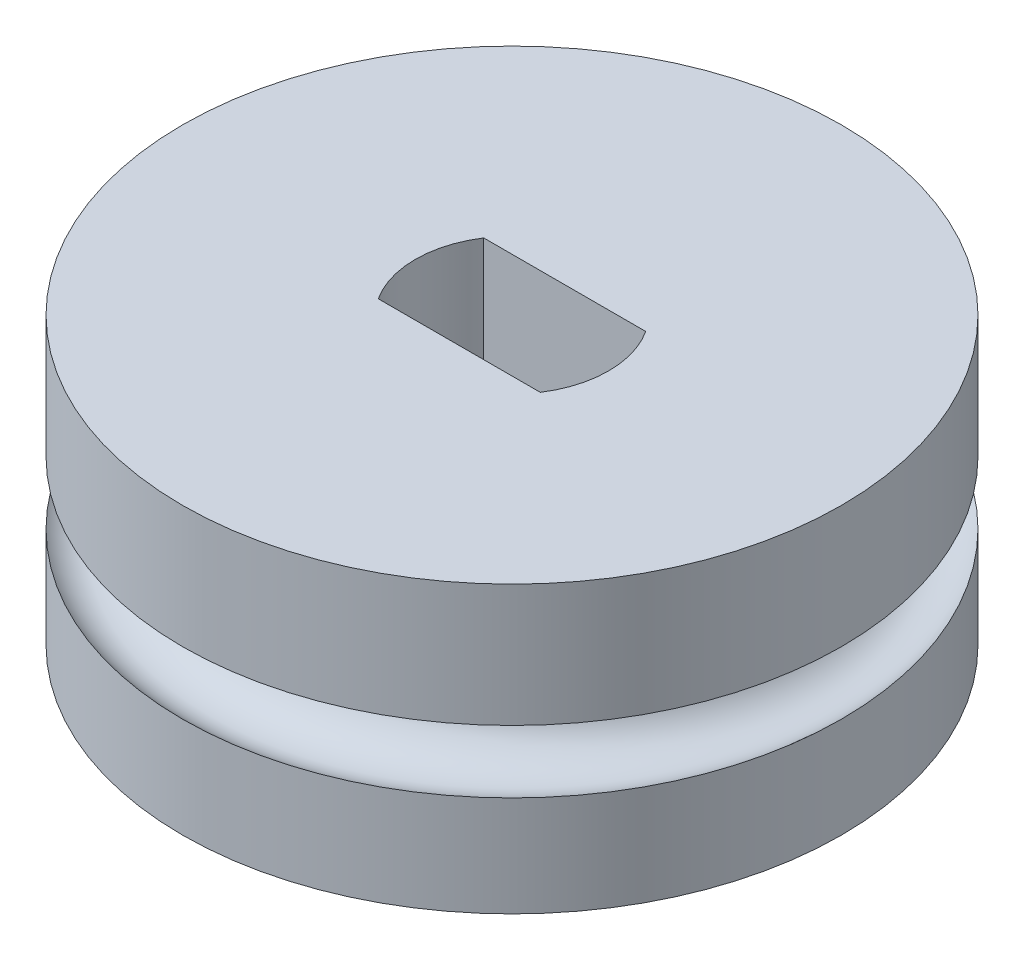
ISO-10303-21;
HEADER;
FILE_DESCRIPTION(('STEP AP214'),'2;1');
FILE_NAME('part.step','',(''),(''),'','','');
FILE_SCHEMA(('AUTOMOTIVE_DESIGN { 1 0 10303 214 1 1 1 1 }'));
ENDSEC;
DATA;
#1=APPLICATION_CONTEXT('core data for automotive mechanical design processes');
#2=APPLICATION_PROTOCOL_DEFINITION('international standard','automotive_design',2000,#1);
#3=PRODUCT_CONTEXT('',#1,'mechanical');
#4=PRODUCT('Part','Part','',(#3));
#5=PRODUCT_RELATED_PRODUCT_CATEGORY('part','',(#4));
#6=PRODUCT_DEFINITION_FORMATION('','',#4);
#7=PRODUCT_DEFINITION_CONTEXT('part definition',#1,'design');
#8=PRODUCT_DEFINITION('design','',#6,#7);
#9=PRODUCT_DEFINITION_SHAPE('','',#8);
#10=(LENGTH_UNIT() NAMED_UNIT(*) SI_UNIT(.MILLI.,.METRE.));
#11=(NAMED_UNIT(*) PLANE_ANGLE_UNIT() SI_UNIT($,.RADIAN.));
#12=(NAMED_UNIT(*) SI_UNIT($,.STERADIAN.) SOLID_ANGLE_UNIT());
#13=UNCERTAINTY_MEASURE_WITH_UNIT(LENGTH_MEASURE(1.E-05),#10,'distance_accuracy_value','');
#14=(GEOMETRIC_REPRESENTATION_CONTEXT(3) GLOBAL_UNCERTAINTY_ASSIGNED_CONTEXT((#13)) GLOBAL_UNIT_ASSIGNED_CONTEXT((#10,
#11,#12)) REPRESENTATION_CONTEXT('',''));
#15=CARTESIAN_POINT('',(0.,0.,0.));
#16=DIRECTION('',(0.,0.,1.));
#17=DIRECTION('',(1.,0.,0.));
#18=AXIS2_PLACEMENT_3D('',#15,#16,#17);
#19=CARTESIAN_POINT('',(0.,-5.01198563445667,1.2));
#20=DIRECTION('',(0.,0.,1.));
#21=DIRECTION('',(1.,0.,0.));
#22=AXIS2_PLACEMENT_3D('',#19,#20,#21);
#23=PLANE('',#22);
#24=DIRECTION('',(1.,0.,0.));
#25=VECTOR('',#24,1.);
#26=CARTESIAN_POINT('',(0.,8.,1.2));
#27=LINE('',#26,#25);
#28=CARTESIAN_POINT('',(-1.84390889145858,8.,1.2));
#29=VERTEX_POINT('',#28);
#30=CARTESIAN_POINT('',(1.84390889145858,8.,1.2));
#31=VERTEX_POINT('',#30);
#32=EDGE_CURVE('E187',#29,#31,#27,.T.);
#33=ORIENTED_EDGE('',*,*,#32,.T.);
#34=DIRECTION('',(0.,1.,0.));
#35=VECTOR('',#34,1.);
#36=CARTESIAN_POINT('',(1.84390889145858,-5.01198563445667,1.2));
#37=LINE('',#36,#35);
#38=CARTESIAN_POINT('',(1.84390889145858,1.,1.2));
#39=VERTEX_POINT('',#38);
#40=EDGE_CURVE('E221',#39,#31,#37,.T.);
#41=ORIENTED_EDGE('',*,*,#40,.F.);
#42=DIRECTION('',(-1.,0.,0.));
#43=VECTOR('',#42,1.);
#44=CARTESIAN_POINT('',(0.,1.,1.2));
#45=LINE('',#44,#43);
#46=CARTESIAN_POINT('',(-1.84390889145858,1.,1.2));
#47=VERTEX_POINT('',#46);
#48=EDGE_CURVE('E203',#39,#47,#45,.T.);
#49=ORIENTED_EDGE('',*,*,#48,.T.);
#50=DIRECTION('',(0.,1.,0.));
#51=VECTOR('',#50,1.);
#52=CARTESIAN_POINT('',(-1.84390889145858,-5.01198563445667,1.2));
#53=LINE('',#52,#51);
#54=EDGE_CURVE('E201',#47,#29,#53,.T.);
#55=ORIENTED_EDGE('',*,*,#54,.T.);
#56=EDGE_LOOP('',(#33,#41,#49,#55));
#57=FACE_BOUND('',#56,.T.);
#58=ADVANCED_FACE('F59',(#57),#23,.F.);
#59=CARTESIAN_POINT('',(0.,-5.01198563445667,-1.2));
#60=DIRECTION('',(0.,0.,1.));
#61=DIRECTION('',(1.,0.,0.));
#62=AXIS2_PLACEMENT_3D('',#59,#60,#61);
#63=PLANE('',#62);
#64=DIRECTION('',(0.,1.,0.));
#65=VECTOR('',#64,1.);
#66=CARTESIAN_POINT('',(1.84390889145858,-5.01198563445667,-1.2));
#67=LINE('',#66,#65);
#68=CARTESIAN_POINT('',(1.84390889145858,0.999999999999998,-1.2));
#69=VERTEX_POINT('',#68);
#70=CARTESIAN_POINT('',(1.84390889145858,8.,-1.2));
#71=VERTEX_POINT('',#70);
#72=EDGE_CURVE('E217',#69,#71,#67,.T.);
#73=ORIENTED_EDGE('',*,*,#72,.T.);
#74=DIRECTION('',(1.,0.,0.));
#75=VECTOR('',#74,1.);
#76=CARTESIAN_POINT('',(0.,8.,-1.2));
#77=LINE('',#76,#75);
#78=CARTESIAN_POINT('',(-1.84390889145858,8.,-1.2));
#79=VERTEX_POINT('',#78);
#80=EDGE_CURVE('E208',#79,#71,#77,.T.);
#81=ORIENTED_EDGE('',*,*,#80,.F.);
#82=DIRECTION('',(0.,1.,0.));
#83=VECTOR('',#82,1.);
#84=CARTESIAN_POINT('',(-1.84390889145858,-5.01198563445667,-1.2));
#85=LINE('',#84,#83);
#86=CARTESIAN_POINT('',(-1.84390889145858,1.,-1.2));
#87=VERTEX_POINT('',#86);
#88=EDGE_CURVE('E214',#87,#79,#85,.T.);
#89=ORIENTED_EDGE('',*,*,#88,.F.);
#90=DIRECTION('',(-1.,0.,0.));
#91=VECTOR('',#90,1.);
#92=CARTESIAN_POINT('',(0.,1.,-1.2));
#93=LINE('',#92,#91);
#94=EDGE_CURVE('E196',#69,#87,#93,.T.);
#95=ORIENTED_EDGE('',*,*,#94,.F.);
#96=EDGE_LOOP('',(#73,#81,#89,#95));
#97=FACE_BOUND('',#96,.T.);
#98=ADVANCED_FACE('F158',(#97),#63,.T.);
#99=CARTESIAN_POINT('',(0.,-21.2132034355964,0.));
#100=DIRECTION('',(0.,1.,0.));
#101=DIRECTION('',(0.,0.,1.));
#102=AXIS2_PLACEMENT_3D('',#99,#100,#101);
#103=CYLINDRICAL_SURFACE('',#102,7.5);
#104=CARTESIAN_POINT('',(0.,3.78585715714572,0.));
#105=DIRECTION('',(0.,1.,0.));
#106=DIRECTION('',(0.,0.,1.));
#107=AXIS2_PLACEMENT_3D('',#104,#105,#106);
#108=CIRCLE('',#107,7.5);
#109=CARTESIAN_POINT('',(0.,3.78585715714572,-7.5));
#110=VERTEX_POINT('',#109);
#111=EDGE_CURVE('E68',#110,#110,#108,.T.);
#112=ORIENTED_EDGE('',*,*,#111,.F.);
#113=EDGE_LOOP('',(#112));
#114=FACE_BOUND('',#113,.T.);
#115=CARTESIAN_POINT('',(0.,1.5,0.));
#116=DIRECTION('',(0.,-1.,0.));
#117=DIRECTION('',(0.,0.,-1.));
#118=AXIS2_PLACEMENT_3D('',#115,#116,#117);
#119=CIRCLE('',#118,7.5);
#120=CARTESIAN_POINT('',(0.,1.5,-7.5));
#121=VERTEX_POINT('',#120);
#122=EDGE_CURVE('E193',#121,#121,#119,.T.);
#123=ORIENTED_EDGE('',*,*,#122,.F.);
#124=EDGE_LOOP('',(#123));
#125=FACE_BOUND('',#124,.T.);
#126=ADVANCED_FACE('F163',(#114,#125),#103,.T.);
#127=CARTESIAN_POINT('',(0.,8.,0.));
#128=DIRECTION('',(0.,1.,0.));
#129=DIRECTION('',(0.,0.,1.));
#130=AXIS2_PLACEMENT_3D('',#127,#128,#129);
#131=PLANE('',#130);
#132=CARTESIAN_POINT('',(0.,8.,0.));
#133=DIRECTION('',(0.,1.,0.));
#134=DIRECTION('',(0.,0.,1.));
#135=AXIS2_PLACEMENT_3D('',#132,#133,#134);
#136=CIRCLE('',#135,2.2);
#137=EDGE_CURVE('E181',#31,#71,#136,.T.);
#138=ORIENTED_EDGE('',*,*,#137,.F.);
#139=ORIENTED_EDGE('',*,*,#32,.F.);
#140=EDGE_CURVE('E209',#79,#29,#136,.T.);
#141=ORIENTED_EDGE('',*,*,#140,.F.);
#142=ORIENTED_EDGE('',*,*,#80,.T.);
#143=EDGE_LOOP('',(#138,#139,#141,#142));
#144=FACE_BOUND('',#143,.T.);
#145=CARTESIAN_POINT('',(0.,8.,0.));
#146=DIRECTION('',(0.,1.,0.));
#147=DIRECTION('',(0.,0.,1.));
#148=AXIS2_PLACEMENT_3D('',#145,#146,#147);
#149=CIRCLE('',#148,7.5);
#150=CARTESIAN_POINT('',(0.,8.,7.5));
#151=VERTEX_POINT('',#150);
#152=EDGE_CURVE('E184',#151,#151,#149,.T.);
#153=ORIENTED_EDGE('',*,*,#152,.T.);
#154=EDGE_LOOP('',(#153));
#155=FACE_BOUND('',#154,.T.);
#156=ADVANCED_FACE('F167',(#144,#155),#131,.T.);
#157=CARTESIAN_POINT('',(0.,-5.01198563445667,0.));
#158=DIRECTION('',(0.,1.,0.));
#159=DIRECTION('',(0.,0.,1.));
#160=AXIS2_PLACEMENT_3D('',#157,#158,#159);
#161=CYLINDRICAL_SURFACE('',#160,2.2);
#162=CARTESIAN_POINT('',(0.,1.,0.));
#163=DIRECTION('',(0.,1.,0.));
#164=DIRECTION('',(0.,0.,1.));
#165=AXIS2_PLACEMENT_3D('',#162,#163,#164);
#166=CIRCLE('',#165,2.2);
#167=EDGE_CURVE('E200',#47,#87,#166,.F.);
#168=ORIENTED_EDGE('',*,*,#167,.T.);
#169=ORIENTED_EDGE('',*,*,#88,.T.);
#170=ORIENTED_EDGE('',*,*,#140,.T.);
#171=ORIENTED_EDGE('',*,*,#54,.F.);
#172=EDGE_LOOP('',(#168,#169,#170,#171));
#173=FACE_BOUND('',#172,.T.);
#174=ADVANCED_FACE('F169',(#173),#161,.F.);
#175=CARTESIAN_POINT('',(0.,1.,0.));
#176=DIRECTION('',(0.,1.,0.));
#177=DIRECTION('',(0.,0.,1.));
#178=AXIS2_PLACEMENT_3D('',#175,#176,#177);
#179=CIRCLE('',#178,2.2);
#180=EDGE_CURVE('E204',#69,#39,#179,.F.);
#181=ORIENTED_EDGE('',*,*,#180,.T.);
#182=ORIENTED_EDGE('',*,*,#40,.T.);
#183=ORIENTED_EDGE('',*,*,#137,.T.);
#184=ORIENTED_EDGE('',*,*,#72,.F.);
#185=EDGE_LOOP('',(#181,#182,#183,#184));
#186=FACE_BOUND('',#185,.T.);
#187=ADVANCED_FACE('F174',(#186),#161,.F.);
#188=CARTESIAN_POINT('',(0.,1.,0.));
#189=DIRECTION('',(0.,1.,0.));
#190=DIRECTION('',(0.,0.,1.));
#191=AXIS2_PLACEMENT_3D('',#188,#189,#190);
#192=PLANE('',#191);
#193=ORIENTED_EDGE('',*,*,#48,.F.);
#194=ORIENTED_EDGE('',*,*,#180,.F.);
#195=ORIENTED_EDGE('',*,*,#94,.T.);
#196=ORIENTED_EDGE('',*,*,#167,.F.);
#197=EDGE_LOOP('',(#193,#194,#195,#196));
#198=FACE_BOUND('',#197,.T.);
#199=ADVANCED_FACE('F251',(#198),#192,.T.);
#200=CARTESIAN_POINT('',(0.,5.21414284285428,0.));
#201=DIRECTION('',(0.,-1.,0.));
#202=DIRECTION('',(0.,0.,-1.));
#203=AXIS2_PLACEMENT_3D('',#200,#201,#202);
#204=CIRCLE('',#203,7.5);
#205=CARTESIAN_POINT('',(0.,5.21414284285428,-7.5));
#206=VERTEX_POINT('',#205);
#207=EDGE_CURVE('E227',#206,#206,#204,.T.);
#208=ORIENTED_EDGE('',*,*,#207,.F.);
#209=EDGE_LOOP('',(#208));
#210=FACE_BOUND('',#209,.T.);
#211=ORIENTED_EDGE('',*,*,#152,.F.);
#212=EDGE_LOOP('',(#211));
#213=FACE_BOUND('',#212,.T.);
#214=ADVANCED_FACE('F154',(#210,#213),#103,.T.);
#215=CARTESIAN_POINT('',(0.,4.5,0.));
#216=DIRECTION('',(0.,-1.,0.));
#217=DIRECTION('',(0.,0.,-1.));
#218=AXIS2_PLACEMENT_3D('',#215,#216,#217);
#219=TOROIDAL_SURFACE('',#218,6.8,1.);
#220=CARTESIAN_POINT('',(0.,5.2,0.));
#221=DIRECTION('',(0.,1.,0.));
#222=DIRECTION('',(0.,0.,1.));
#223=AXIS2_PLACEMENT_3D('',#220,#221,#222);
#224=CIRCLE('',#223,6.08585715714571);
#225=CARTESIAN_POINT('',(-6.0427769594019,5.2,0.722844351228663));
#226=VERTEX_POINT('',#225);
#227=CARTESIAN_POINT('',(-6.0427769594019,5.2,-0.722844351228663));
#228=VERTEX_POINT('',#227);
#229=EDGE_CURVE('E13',#226,#228,#224,.F.);
#230=ORIENTED_EDGE('',*,*,#229,.F.);
#231=CARTESIAN_POINT('',(-6.23014016278492,5.34094636474923,0.599125535929147));
#232=CARTESIAN_POINT('',(-6.21483652507629,5.33198051386924,0.612673729165902));
#233=CARTESIAN_POINT('',(-6.19924553837021,5.3223209192291,0.62541616448251));
#234=CARTESIAN_POINT('',(-6.16778809326167,5.30158388782306,0.649278293484025));
#235=CARTESIAN_POINT('',(-6.15192182518226,5.2905073993514,0.660399061956239));
#236=CARTESIAN_POINT('',(-6.10463838029807,5.25531965407915,0.691135036840744));
#237=CARTESIAN_POINT('',(-6.07322501250057,5.22907538464081,0.708389499165604));
#238=CARTESIAN_POINT('',(-6.01112280230856,5.16977302294412,0.737871939486779));
#239=CARTESIAN_POINT('',(-5.98056359307657,5.13642457258631,0.749780004232419));
#240=CARTESIAN_POINT('',(-5.92393027648112,5.06482216343346,0.76860267079672));
#241=CARTESIAN_POINT('',(-5.89786371498051,5.02656013626157,0.775508932673708));
#242=CARTESIAN_POINT('',(-5.85158197611424,4.946615182626,0.785864727822273));
#243=CARTESIAN_POINT('',(-5.83132784467134,4.90495755304961,0.789337673886762));
#244=CARTESIAN_POINT('',(-5.79698709331275,4.81906931950578,0.794288635899798));
#245=CARTESIAN_POINT('',(-5.78290255169631,4.77483785418667,0.795765979954896));
#246=CARTESIAN_POINT('',(-5.75991141808077,4.67958923313174,0.797848275442555));
#247=CARTESIAN_POINT('',(-5.75179143025008,4.62837865769691,0.798332662434512));
#248=CARTESIAN_POINT('',(-5.74370168279974,4.52531446481744,0.79881512812049));
#249=CARTESIAN_POINT('',(-5.74373395218491,4.47346069049901,0.798813085747737));
#250=CARTESIAN_POINT('',(-5.75221005029015,4.36717216993201,0.798307779240028));
#251=CARTESIAN_POINT('',(-5.7611788734428,4.3127783877184,0.797773232591837));
#252=CARTESIAN_POINT('',(-5.78816467023473,4.20627234389858,0.795241677751739));
#253=CARTESIAN_POINT('',(-5.806186211281,4.15416124842983,0.793243931091897));
#254=CARTESIAN_POINT('',(-5.85043598283564,4.05471818150436,0.786042365308653));
#255=CARTESIAN_POINT('',(-5.8765321879339,4.00732447590586,0.780888903703346));
#256=CARTESIAN_POINT('',(-5.93583181946151,3.9182635687632,0.765059335023062));
#257=CARTESIAN_POINT('',(-5.96902196440694,3.87658590163435,0.754393496181631));
#258=CARTESIAN_POINT('',(-6.03560258560141,3.805438923179,0.726975503856008));
#259=CARTESIAN_POINT('',(-6.06843761005257,3.77509238686389,0.711162917221054));
#260=CARTESIAN_POINT('',(-6.13516706751248,3.72081213991897,0.672390313188757));
#261=CARTESIAN_POINT('',(-6.16906035436668,3.69687174292564,0.649437802593685));
#262=CARTESIAN_POINT('',(-6.22993074981263,3.65856743620578,0.600385131968745));
#263=CARTESIAN_POINT('',(-6.25717138205375,3.64329794046201,0.57530750879007));
#264=CARTESIAN_POINT('',(-6.30874279311262,3.61687154592132,0.52043157323337));
#265=CARTESIAN_POINT('',(-6.33307311138616,3.60571529744732,0.490632515439182));
#266=CARTESIAN_POINT('',(-6.37719583941032,3.58701355218827,0.427624320944309));
#267=CARTESIAN_POINT('',(-6.39705586377502,3.57941206797389,0.394478815800213));
#268=CARTESIAN_POINT('',(-6.43192011473528,3.56688243233632,0.325262563599958));
#269=CARTESIAN_POINT('',(-6.44692353941214,3.56195472231429,0.289191334678563));
#270=CARTESIAN_POINT('',(-6.47225414041002,3.55398936237212,0.212908451843782));
#271=CARTESIAN_POINT('',(-6.48226310215498,3.55107657769679,0.172577983727061));
#272=CARTESIAN_POINT('',(-6.49591723631791,3.54717280138874,0.0907598599206215));
#273=CARTESIAN_POINT('',(-6.49956077307003,3.54618230370153,0.0492719095847534));
#274=CARTESIAN_POINT('',(-6.50037931749134,3.54595580246534,-0.0353400534743612));
#275=CARTESIAN_POINT('',(-6.49730580022696,3.54678721085151,-0.0784668935317196));
#276=CARTESIAN_POINT('',(-6.48427896172801,3.550491489008,-0.163586077479629));
#277=CARTESIAN_POINT('',(-6.47432478418528,3.55336461287402,-0.205578279486863));
#278=CARTESIAN_POINT('',(-6.44786933413316,3.56163449064975,-0.287296015857422));
#279=CARTESIAN_POINT('',(-6.4313538712781,3.56703671889926,-0.327016422509396));
#280=CARTESIAN_POINT('',(-6.39247511036111,3.58111434719564,-0.402854136338897));
#281=CARTESIAN_POINT('',(-6.37011371574154,3.58978868224704,-0.438972611031385));
#282=CARTESIAN_POINT('',(-6.32156472601228,3.61092188285993,-0.505256714057651));
#283=CARTESIAN_POINT('',(-6.2955405186304,3.62323597253476,-0.535587759329248));
#284=CARTESIAN_POINT('',(-6.24063016666398,3.65246795953726,-0.59096280605575));
#285=CARTESIAN_POINT('',(-6.2117459472857,3.66938277312436,-0.616010329017085));
#286=CARTESIAN_POINT('',(-6.15470720131655,3.70709394551578,-0.659125950426953));
#287=CARTESIAN_POINT('',(-6.12660744821079,3.72760843126449,-0.677514485453381));
#288=CARTESIAN_POINT('',(-6.0711999348764,3.77303028269099,-0.709389757783455));
#289=CARTESIAN_POINT('',(-6.04389227518154,3.79793820317443,-0.72287587534766));
#290=CARTESIAN_POINT('',(-5.99127615082543,3.85198852084413,-0.745647598601843));
#291=CARTESIAN_POINT('',(-5.96598944035071,3.88116934081212,-0.754891556561311));
#292=CARTESIAN_POINT('',(-5.91879072594484,3.94294557135221,-0.769899641214449));
#293=CARTESIAN_POINT('',(-5.89688043917357,3.97554270530602,-0.775662001582035));
#294=CARTESIAN_POINT('',(-5.85458962170278,4.04778166551724,-0.785259544484753));
#295=CARTESIAN_POINT('',(-5.83476199736924,4.08779148145936,-0.788754534339019));
#296=CARTESIAN_POINT('',(-5.80081498694204,4.17027809852173,-0.793807781879055));
#297=CARTESIAN_POINT('',(-5.78669908145835,4.21275638590584,-0.795364859835102));
#298=CARTESIAN_POINT('',(-5.76274111209715,4.30586521488066,-0.797642187175254));
#299=CARTESIAN_POINT('',(-5.75387561629473,4.3567530300369,-0.798199139947462));
#300=CARTESIAN_POINT('',(-5.74422746966985,4.4592953055536,-0.798790461485622));
#301=CARTESIAN_POINT('',(-5.74344756617084,4.51095002052168,-0.798824652629443));
#302=CARTESIAN_POINT('',(-5.75019957967234,4.61710214423702,-0.798432541751631));
#303=CARTESIAN_POINT('',(-5.75827548949762,4.67156588913195,-0.797976139486806));
#304=CARTESIAN_POINT('',(-5.78348780337916,4.77840062038693,-0.79573122548343));
#305=CARTESIAN_POINT('',(-5.80063306996227,4.83076950572556,-0.793941410040766));
#306=CARTESIAN_POINT('',(-5.84329748582105,4.93114219043632,-0.787354867579327));
#307=CARTESIAN_POINT('',(-5.86872610674062,4.97918631546521,-0.782590158734574));
#308=CARTESIAN_POINT('',(-5.92686941749764,5.06958913454869,-0.767733776751751));
#309=CARTESIAN_POINT('',(-5.95955002598668,5.11197298404956,-0.75766672801229));
#310=CARTESIAN_POINT('',(-6.00248611107812,5.15927203502362,-0.740657312804439));
#311=CARTESIAN_POINT('',(-6.01044202224948,5.16771836252529,-0.737362039329423));
#312=CARTESIAN_POINT('',(-6.02656425765327,5.18424097648048,-0.730365115452859));
#313=CARTESIAN_POINT('',(-6.03473066512803,5.19231711291972,-0.726663302335127));
#314=CARTESIAN_POINT('',(-6.06989773785675,5.22589623973313,-0.709972436903678));
#315=CARTESIAN_POINT('',(-6.09775760511264,5.24953901779358,-0.694899742331459));
#316=CARTESIAN_POINT('',(-6.15377730351311,5.29234677943597,-0.659680743848888));
#317=CARTESIAN_POINT('',(-6.18193742611358,5.31150689959963,-0.639528978217929));
#318=CARTESIAN_POINT('',(-6.22378686901113,5.33735463052345,-0.604978663861079));
#319=CARTESIAN_POINT('',(-6.23800737070019,5.34564889098483,-0.592381882532189));
#320=CARTESIAN_POINT('',(-6.26580062475781,5.36106226953037,-0.56589610922042));
#321=CARTESIAN_POINT('',(-6.2793747427777,5.36818395113768,-0.55201004279812));
#322=CARTESIAN_POINT('',(-6.29253709324753,5.37476418762898,-0.537493993571804));
#323=B_SPLINE_CURVE_WITH_KNOTS('',3,(#231,#232,#233,#234,#235,#236,#237,#238,#239,#240,#241,
#242,#243,#244,#245,#246,#247,#248,#249,#250,#251,#252,#253,#254,#255,#256,#257,#258,#259,#260,
#261,#262,#263,#264,#265,#266,#267,#268,#269,#270,#271,#272,#273,#274,#275,#276,#277,#278,#279,
#280,#281,#282,#283,#284,#285,#286,#287,#288,#289,#290,#291,#292,#293,#294,#295,#296,#297,#298,
#299,#300,#301,#302,#303,#304,#305,#306,#307,#308,#309,#310,#311,#312,#313,#314,#315,#316,#317,
#318,#319,#320,#321,#322),.UNSPECIFIED.,.F.,.F.,(4,2,2,2,2,2,2,2,2,2,2,2,2,2,2,2,2,2,2,2,2,2,2,
2,2,2,2,2,2,2,2,2,2,2,2,2,2,2,2,2,2,2,2,2,2,4),(0.,0.0669049812390851,0.13376541653671,
0.266173735745224,0.405696895027061,0.545452161166908,0.684247681870661,0.823089921597613,
0.977979301650181,1.13290723195985,1.29750706517469,1.46219002819357,1.62431116178251,
1.78613138534683,1.92750031492702,2.06872111097809,2.1882844716344,2.30786672769851,
2.42549624682269,2.54314517896308,2.66755387435646,2.79199453323114,2.92111706128408,
3.05025566171701,3.17967508903796,3.30905242960811,3.43385177783622,3.55856768170676,
3.67605343546218,3.79355403602663,3.91218474845019,4.03087559561152,4.16472757951963,
4.29866100781552,4.45296498556462,4.60732139101864,4.77171884095532,4.9362772367824,
5.09909435054677,5.26116191318068,5.29733920877342,5.33353103735086,5.4515073440014,
5.56961106046006,5.63172323013886,5.69369775172494),.UNSPECIFIED.);
#324=EDGE_CURVE('E115',#226,#228,#323,.T.);
#325=ORIENTED_EDGE('',*,*,#324,.T.);
#326=EDGE_LOOP('',(#230,#325));
#327=FACE_BOUND('',#326,.T.);
#328=ORIENTED_EDGE('',*,*,#111,.T.);
#329=CARTESIAN_POINT('',(0.,4.5,-6.8));
#330=DIRECTION('',(1.,0.,0.));
#331=DIRECTION('',(0.,1.,0.));
#332=AXIS2_PLACEMENT_3D('',#329,#330,#331);
#333=CIRCLE('',#332,1.);
#334=EDGE_CURVE('E81',#206,#110,#333,.T.);
#335=ORIENTED_EDGE('',*,*,#334,.F.);
#336=ORIENTED_EDGE('',*,*,#207,.T.);
#337=ORIENTED_EDGE('',*,*,#334,.T.);
#338=EDGE_LOOP('',(#328,#335,#336,#337));
#339=FACE_BOUND('',#338,.T.);
#340=ADVANCED_FACE('F119',(#327,#339),#219,.F.);
#341=CARTESIAN_POINT('',(0.,1.5,0.));
#342=DIRECTION('',(0.,-1.,0.));
#343=DIRECTION('',(0.,0.,-1.));
#344=AXIS2_PLACEMENT_3D('',#341,#342,#343);
#345=CYLINDRICAL_SURFACE('',#344,3.25);
#346=CARTESIAN_POINT('',(0.,1.5,0.));
#347=DIRECTION('',(0.,-1.,0.));
#348=DIRECTION('',(0.,0.,-1.));
#349=AXIS2_PLACEMENT_3D('',#346,#347,#348);
#350=CIRCLE('',#349,3.25);
#351=CARTESIAN_POINT('',(0.,1.5,-3.25));
#352=VERTEX_POINT('',#351);
#353=EDGE_CURVE('E127',#352,#352,#350,.T.);
#354=ORIENTED_EDGE('',*,*,#353,.T.);
#355=EDGE_LOOP('',(#354));
#356=FACE_BOUND('',#355,.T.);
#357=CARTESIAN_POINT('',(0.,0.,0.));
#358=DIRECTION('',(0.,-1.,0.));
#359=DIRECTION('',(0.,0.,-1.));
#360=AXIS2_PLACEMENT_3D('',#357,#358,#359);
#361=CIRCLE('',#360,3.25);
#362=CARTESIAN_POINT('',(0.,0.,-3.25));
#363=VERTEX_POINT('',#362);
#364=EDGE_CURVE('E121',#363,#363,#361,.T.);
#365=ORIENTED_EDGE('',*,*,#364,.F.);
#366=EDGE_LOOP('',(#365));
#367=FACE_BOUND('',#366,.T.);
#368=ADVANCED_FACE('F148',(#356,#367),#345,.T.);
#369=CARTESIAN_POINT('',(0.,1.5,0.));
#370=DIRECTION('',(0.,-1.,0.));
#371=DIRECTION('',(0.,0.,-1.));
#372=AXIS2_PLACEMENT_3D('',#369,#370,#371);
#373=PLANE('',#372);
#374=CARTESIAN_POINT('',(-5.7,1.5,0.));
#375=DIRECTION('',(0.,-1.,0.));
#376=DIRECTION('',(0.,0.,-1.));
#377=AXIS2_PLACEMENT_3D('',#374,#375,#376);
#378=CIRCLE('',#377,0.800000000000001);
#379=CARTESIAN_POINT('',(-5.7,1.5,-0.800000000000001));
#380=VERTEX_POINT('',#379);
#381=EDGE_CURVE('E117',#380,#380,#378,.T.);
#382=ORIENTED_EDGE('',*,*,#381,.F.);
#383=EDGE_LOOP('',(#382));
#384=FACE_BOUND('',#383,.T.);
#385=ORIENTED_EDGE('',*,*,#353,.F.);
#386=EDGE_LOOP('',(#385));
#387=FACE_BOUND('',#386,.T.);
#388=ORIENTED_EDGE('',*,*,#122,.T.);
#389=EDGE_LOOP('',(#388));
#390=FACE_BOUND('',#389,.T.);
#391=ADVANCED_FACE('F146',(#384,#387,#390),#373,.T.);
#392=CARTESIAN_POINT('',(0.,0.,0.));
#393=DIRECTION('',(0.,1.,0.));
#394=DIRECTION('',(0.,0.,1.));
#395=AXIS2_PLACEMENT_3D('',#392,#393,#394);
#396=PLANE('',#395);
#397=ORIENTED_EDGE('',*,*,#364,.T.);
#398=EDGE_LOOP('',(#397));
#399=FACE_BOUND('',#398,.T.);
#400=ADVANCED_FACE('F61',(#399),#396,.F.);
#401=CARTESIAN_POINT('',(-5.7,5.2,0.));
#402=DIRECTION('',(0.,-1.,0.));
#403=DIRECTION('',(0.,0.,-1.));
#404=AXIS2_PLACEMENT_3D('',#401,#402,#403);
#405=PLANE('',#404);
#406=ORIENTED_EDGE('',*,*,#229,.T.);
#407=CARTESIAN_POINT('',(-5.7,5.2,0.));
#408=DIRECTION('',(0.,-1.,0.));
#409=DIRECTION('',(0.,0.,-1.));
#410=AXIS2_PLACEMENT_3D('',#407,#408,#409);
#411=CIRCLE('',#410,0.800000000000001);
#412=EDGE_CURVE('E73',#228,#226,#411,.T.);
#413=ORIENTED_EDGE('',*,*,#412,.T.);
#414=EDGE_LOOP('',(#406,#413));
#415=FACE_BOUND('',#414,.T.);
#416=ADVANCED_FACE('F110',(#415),#405,.T.);
#417=CARTESIAN_POINT('',(-5.7,5.2,0.));
#418=DIRECTION('',(0.,-1.,0.));
#419=DIRECTION('',(0.,0.,-1.));
#420=AXIS2_PLACEMENT_3D('',#417,#418,#419);
#421=CYLINDRICAL_SURFACE('',#420,0.800000000000001);
#422=ORIENTED_EDGE('',*,*,#381,.T.);
#423=EDGE_LOOP('',(#422));
#424=FACE_BOUND('',#423,.T.);
#425=ORIENTED_EDGE('',*,*,#412,.F.);
#426=ORIENTED_EDGE('',*,*,#324,.F.);
#427=EDGE_LOOP('',(#425,#426));
#428=FACE_BOUND('',#427,.T.);
#429=ADVANCED_FACE('F114',(#424,#428),#421,.F.);
#430=CLOSED_SHELL('',(#58,#98,#126,#156,#174,#187,#199,#214,#340,#368,#391,#400,#416,#429));
#431=MANIFOLD_SOLID_BREP('B2',#430);
#432=ADVANCED_BREP_SHAPE_REPRESENTATION('',(#18,#431),#14);
#433=SHAPE_DEFINITION_REPRESENTATION(#9,#432);
ENDSEC;
END-ISO-10303-21;
